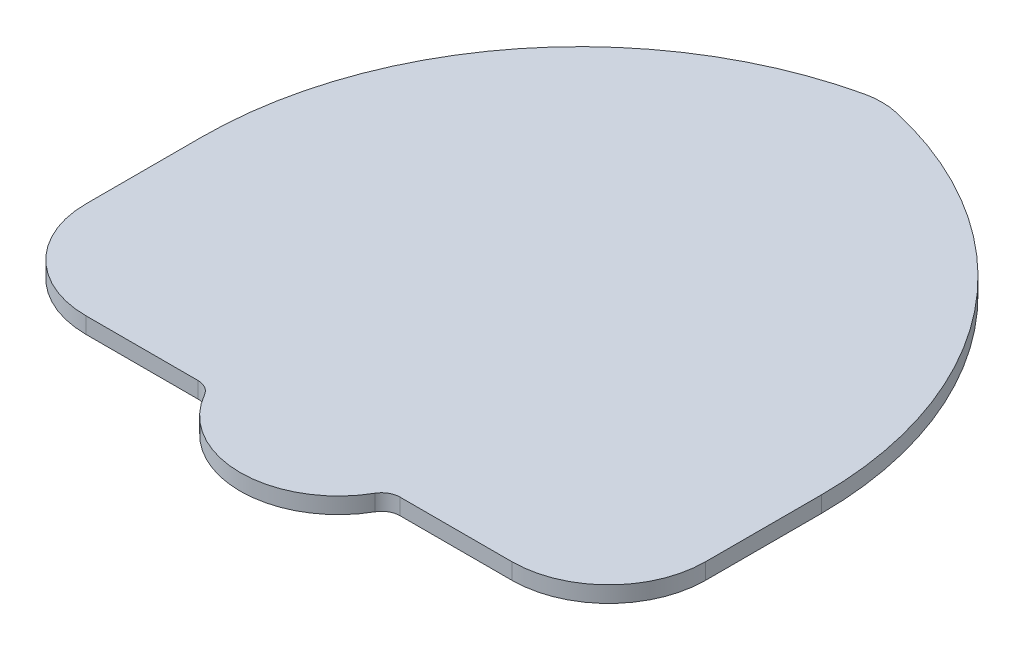
ISO-10303-21;
HEADER;
FILE_DESCRIPTION(('STEP AP214'),'2;1');
FILE_NAME('part.step','',(''),(''),'','','');
FILE_SCHEMA(('AUTOMOTIVE_DESIGN { 1 0 10303 214 1 1 1 1 }'));
ENDSEC;
DATA;
#1=APPLICATION_CONTEXT('core data for automotive mechanical design processes');
#2=APPLICATION_PROTOCOL_DEFINITION('international standard','automotive_design',2000,#1);
#3=PRODUCT_CONTEXT('',#1,'mechanical');
#4=PRODUCT('Part','Part','',(#3));
#5=PRODUCT_RELATED_PRODUCT_CATEGORY('part','',(#4));
#6=PRODUCT_DEFINITION_FORMATION('','',#4);
#7=PRODUCT_DEFINITION_CONTEXT('part definition',#1,'design');
#8=PRODUCT_DEFINITION('design','',#6,#7);
#9=PRODUCT_DEFINITION_SHAPE('','',#8);
#10=(LENGTH_UNIT() NAMED_UNIT(*) SI_UNIT(.MILLI.,.METRE.));
#11=(NAMED_UNIT(*) PLANE_ANGLE_UNIT() SI_UNIT($,.RADIAN.));
#12=(NAMED_UNIT(*) SI_UNIT($,.STERADIAN.) SOLID_ANGLE_UNIT());
#13=UNCERTAINTY_MEASURE_WITH_UNIT(LENGTH_MEASURE(1.E-05),#10,'distance_accuracy_value','');
#14=(GEOMETRIC_REPRESENTATION_CONTEXT(3) GLOBAL_UNCERTAINTY_ASSIGNED_CONTEXT((#13)) GLOBAL_UNIT_ASSIGNED_CONTEXT((#10,
#11,#12)) REPRESENTATION_CONTEXT('',''));
#15=CARTESIAN_POINT('',(0.,0.,0.));
#16=DIRECTION('',(0.,0.,1.));
#17=DIRECTION('',(1.,0.,0.));
#18=AXIS2_PLACEMENT_3D('',#15,#16,#17);
#19=CARTESIAN_POINT('',(0.,5.588,0.));
#20=DIRECTION('',(0.,0.,-1.));
#21=DIRECTION('',(-1.,0.,0.));
#22=AXIS2_PLACEMENT_3D('',#19,#20,#21);
#23=PLANE('',#22);
#24=DIRECTION('',(1.,0.,0.));
#25=VECTOR('',#24,1.);
#26=CARTESIAN_POINT('',(0.,5.588,0.));
#27=LINE('',#26,#25);
#28=CARTESIAN_POINT('',(33.528,5.588,0.));
#29=VERTEX_POINT('',#28);
#30=CARTESIAN_POINT('',(72.2977581754359,5.588,0.));
#31=VERTEX_POINT('',#30);
#32=EDGE_CURVE('E135',#29,#31,#27,.T.);
#33=ORIENTED_EDGE('',*,*,#32,.F.);
#34=DIRECTION('',(0.,-1.,0.));
#35=VECTOR('',#34,1.);
#36=CARTESIAN_POINT('',(33.528,5.588,0.));
#37=LINE('',#36,#35);
#38=CARTESIAN_POINT('',(33.528,0.,0.));
#39=VERTEX_POINT('',#38);
#40=EDGE_CURVE('E43',#29,#39,#37,.T.);
#41=ORIENTED_EDGE('',*,*,#40,.T.);
#42=DIRECTION('',(1.,0.,0.));
#43=VECTOR('',#42,1.);
#44=CARTESIAN_POINT('',(0.,0.,0.));
#45=LINE('',#44,#43);
#46=CARTESIAN_POINT('',(72.2977581754359,0.,0.));
#47=VERTEX_POINT('',#46);
#48=EDGE_CURVE('E160',#39,#47,#45,.T.);
#49=ORIENTED_EDGE('',*,*,#48,.T.);
#50=DIRECTION('',(0.,1.,0.));
#51=VECTOR('',#50,1.);
#52=CARTESIAN_POINT('',(72.2977581754359,5.588,0.));
#53=LINE('',#52,#51);
#54=EDGE_CURVE('E184',#47,#31,#53,.T.);
#55=ORIENTED_EDGE('',*,*,#54,.T.);
#56=EDGE_LOOP('',(#33,#41,#49,#55));
#57=FACE_BOUND('',#56,.T.);
#58=ADVANCED_FACE('F35',(#57),#23,.F.);
#59=CARTESIAN_POINT('',(0.,5.588,0.));
#60=DIRECTION('',(1.,0.,0.));
#61=DIRECTION('',(0.,0.,-1.));
#62=AXIS2_PLACEMENT_3D('',#59,#60,#61);
#63=PLANE('',#62);
#64=DIRECTION('',(0.,0.,1.));
#65=VECTOR('',#64,1.);
#66=CARTESIAN_POINT('',(0.,0.,0.));
#67=LINE('',#66,#65);
#68=CARTESIAN_POINT('',(0.,0.,-73.66));
#69=VERTEX_POINT('',#68);
#70=CARTESIAN_POINT('',(0.,0.,-33.528));
#71=VERTEX_POINT('',#70);
#72=EDGE_CURVE('E156',#69,#71,#67,.T.);
#73=ORIENTED_EDGE('',*,*,#72,.T.);
#74=DIRECTION('',(0.,-1.,0.));
#75=VECTOR('',#74,1.);
#76=CARTESIAN_POINT('',(0.,5.588,-33.528));
#77=LINE('',#76,#75);
#78=CARTESIAN_POINT('',(0.,5.588,-33.528));
#79=VERTEX_POINT('',#78);
#80=EDGE_CURVE('E11',#71,#79,#77,.F.);
#81=ORIENTED_EDGE('',*,*,#80,.T.);
#82=DIRECTION('',(0.,0.,1.));
#83=VECTOR('',#82,1.);
#84=CARTESIAN_POINT('',(0.,5.588,0.));
#85=LINE('',#84,#83);
#86=CARTESIAN_POINT('',(0.,5.588,-73.66));
#87=VERTEX_POINT('',#86);
#88=EDGE_CURVE('E167',#87,#79,#85,.T.);
#89=ORIENTED_EDGE('',*,*,#88,.F.);
#90=DIRECTION('',(0.,-1.,0.));
#91=VECTOR('',#90,1.);
#92=CARTESIAN_POINT('',(0.,5.588,-73.66));
#93=LINE('',#92,#91);
#94=EDGE_CURVE('E146',#87,#69,#93,.T.);
#95=ORIENTED_EDGE('',*,*,#94,.T.);
#96=EDGE_LOOP('',(#73,#81,#89,#95));
#97=FACE_BOUND('',#96,.T.);
#98=ADVANCED_FACE('F247',(#97),#63,.F.);
#99=CARTESIAN_POINT('',(142.332241824564,0.,0.));
#100=VERTEX_POINT('',#99);
#101=CARTESIAN_POINT('',(181.102,0.,0.));
#102=VERTEX_POINT('',#101);
#103=EDGE_CURVE('E158',#100,#102,#45,.T.);
#104=ORIENTED_EDGE('',*,*,#103,.T.);
#105=DIRECTION('',(0.,-1.,0.));
#106=VECTOR('',#105,1.);
#107=CARTESIAN_POINT('',(181.102,5.588,0.));
#108=LINE('',#107,#106);
#109=CARTESIAN_POINT('',(181.102,5.588,0.));
#110=VERTEX_POINT('',#109);
#111=EDGE_CURVE('E202',#102,#110,#108,.F.);
#112=ORIENTED_EDGE('',*,*,#111,.T.);
#113=CARTESIAN_POINT('',(142.332241824564,5.588,0.));
#114=VERTEX_POINT('',#113);
#115=EDGE_CURVE('E230',#114,#110,#27,.T.);
#116=ORIENTED_EDGE('',*,*,#115,.F.);
#117=DIRECTION('',(0.,1.,0.));
#118=VECTOR('',#117,1.);
#119=CARTESIAN_POINT('',(142.332241824564,5.588,0.));
#120=LINE('',#119,#118);
#121=EDGE_CURVE('E182',#114,#100,#120,.F.);
#122=ORIENTED_EDGE('',*,*,#121,.T.);
#123=EDGE_LOOP('',(#104,#112,#116,#122));
#124=FACE_BOUND('',#123,.T.);
#125=ADVANCED_FACE('F254',(#124),#23,.F.);
#126=CARTESIAN_POINT('',(214.63,5.588,0.));
#127=DIRECTION('',(-1.,0.,0.));
#128=DIRECTION('',(0.,0.,1.));
#129=AXIS2_PLACEMENT_3D('',#126,#127,#128);
#130=PLANE('',#129);
#131=DIRECTION('',(0.,0.,-1.));
#132=VECTOR('',#131,1.);
#133=CARTESIAN_POINT('',(214.63,5.588,0.));
#134=LINE('',#133,#132);
#135=CARTESIAN_POINT('',(214.63,5.588,-33.528));
#136=VERTEX_POINT('',#135);
#137=CARTESIAN_POINT('',(214.63,5.588,-73.66));
#138=VERTEX_POINT('',#137);
#139=EDGE_CURVE('E123',#136,#138,#134,.T.);
#140=ORIENTED_EDGE('',*,*,#139,.F.);
#141=DIRECTION('',(0.,-1.,0.));
#142=VECTOR('',#141,1.);
#143=CARTESIAN_POINT('',(214.63,5.588,-33.528));
#144=LINE('',#143,#142);
#145=CARTESIAN_POINT('',(214.63,0.,-33.528));
#146=VERTEX_POINT('',#145);
#147=EDGE_CURVE('E196',#136,#146,#144,.T.);
#148=ORIENTED_EDGE('',*,*,#147,.T.);
#149=DIRECTION('',(0.,0.,-1.));
#150=VECTOR('',#149,1.);
#151=CARTESIAN_POINT('',(214.63,0.,0.));
#152=LINE('',#151,#150);
#153=CARTESIAN_POINT('',(214.63,0.,-73.66));
#154=VERTEX_POINT('',#153);
#155=EDGE_CURVE('E141',#146,#154,#152,.T.);
#156=ORIENTED_EDGE('',*,*,#155,.T.);
#157=DIRECTION('',(0.,-1.,0.));
#158=VECTOR('',#157,1.);
#159=CARTESIAN_POINT('',(214.63,5.588,-73.66));
#160=LINE('',#159,#158);
#161=EDGE_CURVE('E138',#138,#154,#160,.T.);
#162=ORIENTED_EDGE('',*,*,#161,.F.);
#163=EDGE_LOOP('',(#140,#148,#156,#162));
#164=FACE_BOUND('',#163,.T.);
#165=ADVANCED_FACE('F139',(#164),#130,.F.);
#166=CARTESIAN_POINT('',(83.7057,5.588,-73.66));
#167=DIRECTION('',(0.,-1.,0.));
#168=DIRECTION('',(0.,0.,-1.));
#169=AXIS2_PLACEMENT_3D('',#166,#167,#168);
#170=CYLINDRICAL_SURFACE('',#169,130.9243);
#171=CARTESIAN_POINT('',(83.7057,0.,-73.66));
#172=DIRECTION('',(0.,1.,0.));
#173=DIRECTION('',(0.,0.,-1.));
#174=AXIS2_PLACEMENT_3D('',#171,#172,#173);
#175=CIRCLE('',#174,130.9243);
#176=CARTESIAN_POINT('',(112.997825851486,0.,-201.265421881637));
#177=VERTEX_POINT('',#176);
#178=EDGE_CURVE('E163',#154,#177,#175,.T.);
#179=ORIENTED_EDGE('',*,*,#178,.T.);
#180=DIRECTION('',(0.,-1.,0.));
#181=VECTOR('',#180,1.);
#182=CARTESIAN_POINT('',(112.997825851486,5.588,-201.265421881637));
#183=LINE('',#182,#181);
#184=CARTESIAN_POINT('',(112.997825851486,5.588,-201.265421881637));
#185=VERTEX_POINT('',#184);
#186=EDGE_CURVE('E150',#177,#185,#183,.F.);
#187=ORIENTED_EDGE('',*,*,#186,.T.);
#188=CARTESIAN_POINT('',(83.7057,5.588,-73.66));
#189=DIRECTION('',(0.,1.,0.));
#190=DIRECTION('',(0.,0.,-1.));
#191=AXIS2_PLACEMENT_3D('',#188,#189,#190);
#192=CIRCLE('',#191,130.9243);
#193=EDGE_CURVE('E128',#138,#185,#192,.T.);
#194=ORIENTED_EDGE('',*,*,#193,.F.);
#195=ORIENTED_EDGE('',*,*,#161,.T.);
#196=EDGE_LOOP('',(#179,#187,#194,#195));
#197=FACE_BOUND('',#196,.T.);
#198=ADVANCED_FACE('F148',(#197),#170,.T.);
#199=CARTESIAN_POINT('',(130.9243,5.588,-73.66));
#200=DIRECTION('',(0.,-1.,0.));
#201=DIRECTION('',(0.,0.,-1.));
#202=AXIS2_PLACEMENT_3D('',#199,#200,#201);
#203=CYLINDRICAL_SURFACE('',#202,130.9243);
#204=CARTESIAN_POINT('',(130.9243,5.588,-73.66));
#205=DIRECTION('',(0.,1.,0.));
#206=DIRECTION('',(0.,0.,1.));
#207=AXIS2_PLACEMENT_3D('',#204,#205,#206);
#208=CIRCLE('',#207,130.9243);
#209=CARTESIAN_POINT('',(101.632174148514,5.588,-201.265421881637));
#210=VERTEX_POINT('',#209);
#211=EDGE_CURVE('E151',#210,#87,#208,.T.);
#212=ORIENTED_EDGE('',*,*,#211,.F.);
#213=DIRECTION('',(0.,-1.,0.));
#214=VECTOR('',#213,1.);
#215=CARTESIAN_POINT('',(101.632174148514,5.588,-201.265421881637));
#216=LINE('',#215,#214);
#217=CARTESIAN_POINT('',(101.632174148514,0.,-201.265421881637));
#218=VERTEX_POINT('',#217);
#219=EDGE_CURVE('E145',#210,#218,#216,.T.);
#220=ORIENTED_EDGE('',*,*,#219,.T.);
#221=CARTESIAN_POINT('',(130.9243,0.,-73.66));
#222=DIRECTION('',(0.,1.,0.));
#223=DIRECTION('',(0.,0.,1.));
#224=AXIS2_PLACEMENT_3D('',#221,#222,#223);
#225=CIRCLE('',#224,130.9243);
#226=EDGE_CURVE('E165',#218,#69,#225,.T.);
#227=ORIENTED_EDGE('',*,*,#226,.T.);
#228=ORIENTED_EDGE('',*,*,#94,.F.);
#229=EDGE_LOOP('',(#212,#220,#227,#228));
#230=FACE_BOUND('',#229,.T.);
#231=ADVANCED_FACE('F246',(#230),#203,.T.);
#232=CARTESIAN_POINT('',(130.9243,5.588,-73.66));
#233=DIRECTION('',(0.,1.,0.));
#234=DIRECTION('',(0.,0.,1.));
#235=AXIS2_PLACEMENT_3D('',#232,#233,#234);
#236=PLANE('',#235);
#237=ORIENTED_EDGE('',*,*,#115,.T.);
#238=CARTESIAN_POINT('',(181.102,5.588,-33.528));
#239=DIRECTION('',(0.,1.,0.));
#240=DIRECTION('',(0.,0.,1.));
#241=AXIS2_PLACEMENT_3D('',#238,#239,#240);
#242=CIRCLE('',#241,33.528);
#243=EDGE_CURVE('E131',#110,#136,#242,.T.);
#244=ORIENTED_EDGE('',*,*,#243,.T.);
#245=ORIENTED_EDGE('',*,*,#139,.T.);
#246=ORIENTED_EDGE('',*,*,#193,.T.);
#247=CARTESIAN_POINT('',(107.315,5.588,-176.509301621353));
#248=DIRECTION('',(0.,1.,0.));
#249=DIRECTION('',(0.,0.,1.));
#250=AXIS2_PLACEMENT_3D('',#247,#248,#249);
#251=CIRCLE('',#250,25.4);
#252=EDGE_CURVE('E175',#185,#210,#251,.T.);
#253=ORIENTED_EDGE('',*,*,#252,.T.);
#254=ORIENTED_EDGE('',*,*,#211,.T.);
#255=ORIENTED_EDGE('',*,*,#88,.T.);
#256=CARTESIAN_POINT('',(33.528,5.588,-33.528));
#257=DIRECTION('',(0.,1.,0.));
#258=DIRECTION('',(0.,0.,1.));
#259=AXIS2_PLACEMENT_3D('',#256,#257,#258);
#260=CIRCLE('',#259,33.528);
#261=EDGE_CURVE('E50',#79,#29,#260,.T.);
#262=ORIENTED_EDGE('',*,*,#261,.T.);
#263=ORIENTED_EDGE('',*,*,#32,.T.);
#264=CARTESIAN_POINT('',(72.2977581754359,5.588,6.35));
#265=DIRECTION('',(0.,1.,0.));
#266=DIRECTION('',(0.,0.,1.));
#267=AXIS2_PLACEMENT_3D('',#264,#265,#266);
#268=CIRCLE('',#267,6.35);
#269=CARTESIAN_POINT('',(77.8109278599921,5.588,3.19921279212792));
#270=VERTEX_POINT('',#269);
#271=EDGE_CURVE('E191',#31,#270,#268,.F.);
#272=ORIENTED_EDGE('',*,*,#271,.T.);
#273=CARTESIAN_POINT('',(107.315,5.588,-13.662421875));
#274=DIRECTION('',(0.,1.,0.));
#275=DIRECTION('',(0.,0.,1.));
#276=AXIS2_PLACEMENT_3D('',#273,#274,#275);
#277=CIRCLE('',#276,33.982421875);
#278=CARTESIAN_POINT('',(136.819072140008,5.588,3.19921279212793));
#279=VERTEX_POINT('',#278);
#280=EDGE_CURVE('E223',#270,#279,#277,.T.);
#281=ORIENTED_EDGE('',*,*,#280,.T.);
#282=CARTESIAN_POINT('',(142.332241824564,5.588,6.35));
#283=DIRECTION('',(0.,1.,0.));
#284=DIRECTION('',(0.,0.,1.));
#285=AXIS2_PLACEMENT_3D('',#282,#283,#284);
#286=CIRCLE('',#285,6.35);
#287=EDGE_CURVE('E187',#279,#114,#286,.F.);
#288=ORIENTED_EDGE('',*,*,#287,.T.);
#289=EDGE_LOOP('',(#237,#244,#245,#246,#253,#254,#255,#262,#263,#272,#281,#288));
#290=FACE_BOUND('',#289,.T.);
#291=ADVANCED_FACE('F126',(#290),#236,.T.);
#292=CARTESIAN_POINT('',(130.9243,0.,-73.66));
#293=DIRECTION('',(0.,1.,0.));
#294=DIRECTION('',(0.,0.,1.));
#295=AXIS2_PLACEMENT_3D('',#292,#293,#294);
#296=PLANE('',#295);
#297=ORIENTED_EDGE('',*,*,#155,.F.);
#298=CARTESIAN_POINT('',(181.102,0.,-33.528));
#299=DIRECTION('',(0.,1.,0.));
#300=DIRECTION('',(0.,0.,1.));
#301=AXIS2_PLACEMENT_3D('',#298,#299,#300);
#302=CIRCLE('',#301,33.528);
#303=EDGE_CURVE('E200',#146,#102,#302,.F.);
#304=ORIENTED_EDGE('',*,*,#303,.T.);
#305=ORIENTED_EDGE('',*,*,#103,.F.);
#306=CARTESIAN_POINT('',(142.332241824564,0.,6.35));
#307=DIRECTION('',(0.,1.,0.));
#308=DIRECTION('',(0.,0.,1.));
#309=AXIS2_PLACEMENT_3D('',#306,#307,#308);
#310=CIRCLE('',#309,6.35);
#311=CARTESIAN_POINT('',(136.819072140008,0.,3.19921279212793));
#312=VERTEX_POINT('',#311);
#313=EDGE_CURVE('E189',#100,#312,#310,.T.);
#314=ORIENTED_EDGE('',*,*,#313,.T.);
#315=CARTESIAN_POINT('',(107.315,0.,-13.662421875));
#316=DIRECTION('',(0.,1.,0.));
#317=DIRECTION('',(0.,0.,1.));
#318=AXIS2_PLACEMENT_3D('',#315,#316,#317);
#319=CIRCLE('',#318,33.982421875);
#320=CARTESIAN_POINT('',(77.8109278599921,0.,3.19921279212792));
#321=VERTEX_POINT('',#320);
#322=EDGE_CURVE('E159',#312,#321,#319,.F.);
#323=ORIENTED_EDGE('',*,*,#322,.T.);
#324=CARTESIAN_POINT('',(72.2977581754359,0.,6.35));
#325=DIRECTION('',(0.,1.,0.));
#326=DIRECTION('',(0.,0.,1.));
#327=AXIS2_PLACEMENT_3D('',#324,#325,#326);
#328=CIRCLE('',#327,6.35);
#329=EDGE_CURVE('E193',#321,#47,#328,.T.);
#330=ORIENTED_EDGE('',*,*,#329,.T.);
#331=ORIENTED_EDGE('',*,*,#48,.F.);
#332=CARTESIAN_POINT('',(33.528,0.,-33.528));
#333=DIRECTION('',(0.,1.,0.));
#334=DIRECTION('',(0.,0.,1.));
#335=AXIS2_PLACEMENT_3D('',#332,#333,#334);
#336=CIRCLE('',#335,33.528);
#337=EDGE_CURVE('E198',#39,#71,#336,.F.);
#338=ORIENTED_EDGE('',*,*,#337,.T.);
#339=ORIENTED_EDGE('',*,*,#72,.F.);
#340=ORIENTED_EDGE('',*,*,#226,.F.);
#341=CARTESIAN_POINT('',(107.315,0.,-176.509301621353));
#342=DIRECTION('',(0.,1.,0.));
#343=DIRECTION('',(0.,0.,1.));
#344=AXIS2_PLACEMENT_3D('',#341,#342,#343);
#345=CIRCLE('',#344,25.4);
#346=EDGE_CURVE('E172',#218,#177,#345,.F.);
#347=ORIENTED_EDGE('',*,*,#346,.T.);
#348=ORIENTED_EDGE('',*,*,#178,.F.);
#349=EDGE_LOOP('',(#297,#304,#305,#314,#323,#330,#331,#338,#339,#340,#347,#348));
#350=FACE_BOUND('',#349,.T.);
#351=ADVANCED_FACE('F211',(#350),#296,.F.);
#352=CARTESIAN_POINT('',(107.315,5.588,-176.509301621353));
#353=DIRECTION('',(0.,-1.,0.));
#354=DIRECTION('',(0.,0.,-1.));
#355=AXIS2_PLACEMENT_3D('',#352,#353,#354);
#356=CYLINDRICAL_SURFACE('',#355,25.4);
#357=ORIENTED_EDGE('',*,*,#252,.F.);
#358=ORIENTED_EDGE('',*,*,#186,.F.);
#359=ORIENTED_EDGE('',*,*,#346,.F.);
#360=ORIENTED_EDGE('',*,*,#219,.F.);
#361=EDGE_LOOP('',(#357,#358,#359,#360));
#362=FACE_BOUND('',#361,.T.);
#363=ADVANCED_FACE('F241',(#362),#356,.T.);
#364=CARTESIAN_POINT('',(107.315,-65.4635417618082,-13.662421875));
#365=DIRECTION('',(0.,1.,0.));
#366=DIRECTION('',(0.,0.,1.));
#367=AXIS2_PLACEMENT_3D('',#364,#365,#366);
#368=CYLINDRICAL_SURFACE('',#367,33.982421875);
#369=ORIENTED_EDGE('',*,*,#322,.F.);
#370=DIRECTION('',(0.,1.,0.));
#371=VECTOR('',#370,1.);
#372=CARTESIAN_POINT('',(136.819072140008,-65.4635417618082,3.19921279212792));
#373=LINE('',#372,#371);
#374=EDGE_CURVE('E179',#312,#279,#373,.T.);
#375=ORIENTED_EDGE('',*,*,#374,.T.);
#376=ORIENTED_EDGE('',*,*,#280,.F.);
#377=DIRECTION('',(0.,1.,0.));
#378=VECTOR('',#377,1.);
#379=CARTESIAN_POINT('',(77.8109278599921,-65.4635417618082,3.19921279212792));
#380=LINE('',#379,#378);
#381=EDGE_CURVE('E177',#270,#321,#380,.F.);
#382=ORIENTED_EDGE('',*,*,#381,.T.);
#383=EDGE_LOOP('',(#369,#375,#376,#382));
#384=FACE_BOUND('',#383,.T.);
#385=ADVANCED_FACE('F225',(#384),#368,.T.);
#386=CARTESIAN_POINT('',(142.332241824564,-65.4635417618082,6.35));
#387=DIRECTION('',(0.,1.,0.));
#388=DIRECTION('',(0.,0.,1.));
#389=AXIS2_PLACEMENT_3D('',#386,#387,#388);
#390=CYLINDRICAL_SURFACE('',#389,6.35);
#391=ORIENTED_EDGE('',*,*,#313,.F.);
#392=ORIENTED_EDGE('',*,*,#121,.F.);
#393=ORIENTED_EDGE('',*,*,#287,.F.);
#394=ORIENTED_EDGE('',*,*,#374,.F.);
#395=EDGE_LOOP('',(#391,#392,#393,#394));
#396=FACE_BOUND('',#395,.T.);
#397=ADVANCED_FACE('F266',(#396),#390,.F.);
#398=CARTESIAN_POINT('',(72.2977581754359,-65.4635417618082,6.35));
#399=DIRECTION('',(0.,1.,0.));
#400=DIRECTION('',(0.,0.,1.));
#401=AXIS2_PLACEMENT_3D('',#398,#399,#400);
#402=CYLINDRICAL_SURFACE('',#401,6.35);
#403=ORIENTED_EDGE('',*,*,#329,.F.);
#404=ORIENTED_EDGE('',*,*,#381,.F.);
#405=ORIENTED_EDGE('',*,*,#271,.F.);
#406=ORIENTED_EDGE('',*,*,#54,.F.);
#407=EDGE_LOOP('',(#403,#404,#405,#406));
#408=FACE_BOUND('',#407,.T.);
#409=ADVANCED_FACE('F220',(#408),#402,.F.);
#410=CARTESIAN_POINT('',(181.102,5.588,-33.528));
#411=DIRECTION('',(0.,-1.,0.));
#412=DIRECTION('',(0.,0.,-1.));
#413=AXIS2_PLACEMENT_3D('',#410,#411,#412);
#414=CYLINDRICAL_SURFACE('',#413,33.528);
#415=ORIENTED_EDGE('',*,*,#243,.F.);
#416=ORIENTED_EDGE('',*,*,#111,.F.);
#417=ORIENTED_EDGE('',*,*,#303,.F.);
#418=ORIENTED_EDGE('',*,*,#147,.F.);
#419=EDGE_LOOP('',(#415,#416,#417,#418));
#420=FACE_BOUND('',#419,.T.);
#421=ADVANCED_FACE('F236',(#420),#414,.T.);
#422=CARTESIAN_POINT('',(33.528,5.588,-33.528));
#423=DIRECTION('',(0.,-1.,0.));
#424=DIRECTION('',(0.,0.,-1.));
#425=AXIS2_PLACEMENT_3D('',#422,#423,#424);
#426=CYLINDRICAL_SURFACE('',#425,33.528);
#427=ORIENTED_EDGE('',*,*,#261,.F.);
#428=ORIENTED_EDGE('',*,*,#80,.F.);
#429=ORIENTED_EDGE('',*,*,#337,.F.);
#430=ORIENTED_EDGE('',*,*,#40,.F.);
#431=EDGE_LOOP('',(#427,#428,#429,#430));
#432=FACE_BOUND('',#431,.T.);
#433=ADVANCED_FACE('F37',(#432),#426,.T.);
#434=CLOSED_SHELL('',(#58,#98,#125,#165,#198,#231,#291,#351,#363,#385,#397,#409,#421,#433));
#435=MANIFOLD_SOLID_BREP('B2',#434);
#436=ADVANCED_BREP_SHAPE_REPRESENTATION('',(#18,#435),#14);
#437=SHAPE_DEFINITION_REPRESENTATION(#9,#436);
ENDSEC;
END-ISO-10303-21;
